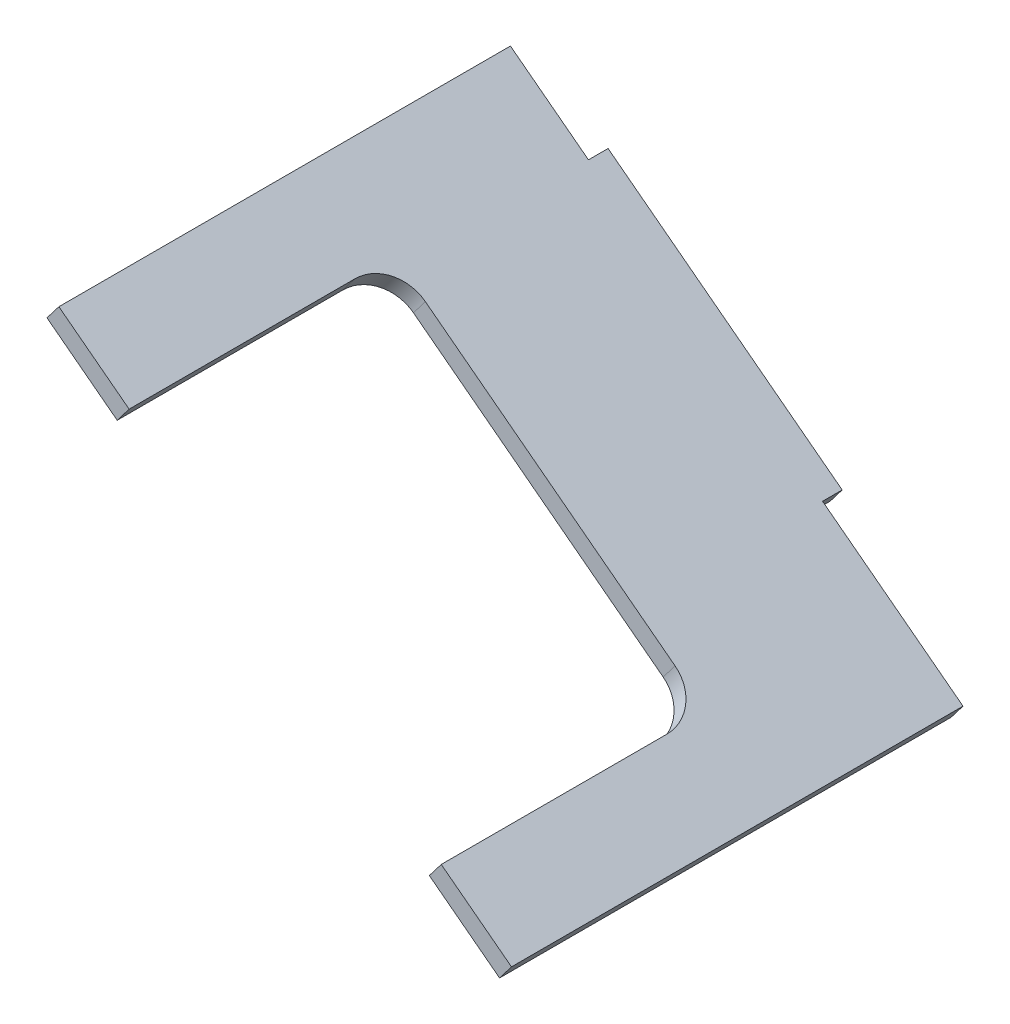
ISO-10303-21;
HEADER;
FILE_DESCRIPTION(('STEP AP214'),'2;1');
FILE_NAME('part.step','',(''),(''),'','','');
FILE_SCHEMA(('AUTOMOTIVE_DESIGN { 1 0 10303 214 1 1 1 1 }'));
ENDSEC;
DATA;
#1=APPLICATION_CONTEXT('core data for automotive mechanical design processes');
#2=APPLICATION_PROTOCOL_DEFINITION('international standard','automotive_design',2000,#1);
#3=PRODUCT_CONTEXT('',#1,'mechanical');
#4=PRODUCT('Part','Part','',(#3));
#5=PRODUCT_RELATED_PRODUCT_CATEGORY('part','',(#4));
#6=PRODUCT_DEFINITION_FORMATION('','',#4);
#7=PRODUCT_DEFINITION_CONTEXT('part definition',#1,'design');
#8=PRODUCT_DEFINITION('design','',#6,#7);
#9=PRODUCT_DEFINITION_SHAPE('','',#8);
#10=(LENGTH_UNIT() NAMED_UNIT(*) SI_UNIT(.MILLI.,.METRE.));
#11=(NAMED_UNIT(*) PLANE_ANGLE_UNIT() SI_UNIT($,.RADIAN.));
#12=(NAMED_UNIT(*) SI_UNIT($,.STERADIAN.) SOLID_ANGLE_UNIT());
#13=UNCERTAINTY_MEASURE_WITH_UNIT(LENGTH_MEASURE(1.E-05),#10,'distance_accuracy_value','');
#14=(GEOMETRIC_REPRESENTATION_CONTEXT(3) GLOBAL_UNCERTAINTY_ASSIGNED_CONTEXT((#13)) GLOBAL_UNIT_ASSIGNED_CONTEXT((#10,
#11,#12)) REPRESENTATION_CONTEXT('',''));
#15=CARTESIAN_POINT('',(0.,0.,0.));
#16=DIRECTION('',(0.,0.,1.));
#17=DIRECTION('',(1.,0.,0.));
#18=AXIS2_PLACEMENT_3D('',#15,#16,#17);
#19=CARTESIAN_POINT('',(-144.,-8.40039843241769E-13,46.));
#20=DIRECTION('',(0.,0.,-1.));
#21=DIRECTION('',(0.,1.,0.));
#22=AXIS2_PLACEMENT_3D('',#19,#20,#21);
#23=PLANE('',#22);
#24=DIRECTION('',(-0.7949376110826,0.606691185436453,0.));
#25=VECTOR('',#24,1.);
#26=CARTESIAN_POINT('',(37.3227741318164,67.208147347463,46.));
#27=LINE('',#26,#25);
#28=CARTESIAN_POINT('',(36.5278365207338,67.8148385328995,46.));
#29=VERTEX_POINT('',#28);
#30=CARTESIAN_POINT('',(29.3733980209904,73.2750592018276,46.));
#31=VERTEX_POINT('',#30);
#32=EDGE_CURVE('E147',#29,#31,#27,.T.);
#33=ORIENTED_EDGE('',*,*,#32,.F.);
#34=DIRECTION('',(0.606691185436452,0.794937611082601,0.));
#35=VECTOR('',#34,1.);
#36=CARTESIAN_POINT('',(-62.6256531425399,-62.1043692873406,46.));
#37=LINE('',#36,#35);
#38=CARTESIAN_POINT('',(37.7412188916067,69.4047137550647,46.));
#39=VERTEX_POINT('',#38);
#40=EDGE_CURVE('E136',#29,#39,#37,.T.);
#41=ORIENTED_EDGE('',*,*,#40,.T.);
#42=DIRECTION('',(0.794937611082601,-0.606691185436452,0.));
#43=VECTOR('',#42,1.);
#44=CARTESIAN_POINT('',(62.3842848351674,50.5972870065347,46.));
#45=LINE('',#44,#43);
#46=CARTESIAN_POINT('',(30.5867803918633,74.8649344239928,46.));
#47=VERTEX_POINT('',#46);
#48=EDGE_CURVE('E145',#47,#39,#45,.T.);
#49=ORIENTED_EDGE('',*,*,#48,.F.);
#50=DIRECTION('',(-0.606691185436453,-0.7949376110826,0.));
#51=VECTOR('',#50,1.);
#52=CARTESIAN_POINT('',(60.5551142552356,114.131955770836,46.));
#53=LINE('',#52,#51);
#54=EDGE_CURVE('E214',#47,#31,#53,.T.);
#55=ORIENTED_EDGE('',*,*,#54,.T.);
#56=EDGE_LOOP('',(#33,#41,#49,#55));
#57=FACE_BOUND('',#56,.T.);
#58=ADVANCED_FACE('F33',(#57),#23,.F.);
#59=CARTESIAN_POINT('',(38.5361565026893,68.7980225696282,77.9334870314499));
#60=DIRECTION('',(0.794937611082609,-0.606691185436442,0.));
#61=DIRECTION('',(0.606691185436442,0.794937611082609,0.));
#62=AXIS2_PLACEMENT_3D('',#59,#60,#61);
#63=PLANE('',#62);
#64=DIRECTION('',(-0.606691185436453,-0.7949376110826,0.));
#65=VECTOR('',#64,1.);
#66=CARTESIAN_POINT('',(68.5044903660616,108.065043916472,0.));
#67=LINE('',#66,#65);
#68=CARTESIAN_POINT('',(38.5361565026893,68.7980225696282,0.));
#69=VERTEX_POINT('',#68);
#70=CARTESIAN_POINT('',(37.3227741318165,67.208147347463,0.));
#71=VERTEX_POINT('',#70);
#72=EDGE_CURVE('E197',#69,#71,#67,.T.);
#73=ORIENTED_EDGE('',*,*,#72,.F.);
#74=DIRECTION('',(0.,0.,-1.));
#75=VECTOR('',#74,1.);
#76=CARTESIAN_POINT('',(38.5361565026893,68.7980225696282,77.9334870314499));
#77=LINE('',#76,#75);
#78=CARTESIAN_POINT('',(38.5361565026893,68.7980225696282,-1.99999999999999));
#79=VERTEX_POINT('',#78);
#80=EDGE_CURVE('E210',#69,#79,#77,.T.);
#81=ORIENTED_EDGE('',*,*,#80,.T.);
#82=DIRECTION('',(-0.606691185436442,-0.794937611082609,0.));
#83=VECTOR('',#82,1.);
#84=CARTESIAN_POINT('',(38.5361565026893,68.7980225696282,-1.99999999999999));
#85=LINE('',#84,#83);
#86=CARTESIAN_POINT('',(37.3227741318164,67.208147347463,-1.99999999999999));
#87=VERTEX_POINT('',#86);
#88=EDGE_CURVE('E162',#79,#87,#85,.T.);
#89=ORIENTED_EDGE('',*,*,#88,.T.);
#90=DIRECTION('',(0.,0.,-1.));
#91=VECTOR('',#90,1.);
#92=CARTESIAN_POINT('',(37.3227741318164,67.208147347463,77.9334870314499));
#93=LINE('',#92,#91);
#94=EDGE_CURVE('E172',#71,#87,#93,.T.);
#95=ORIENTED_EDGE('',*,*,#94,.F.);
#96=EDGE_LOOP('',(#73,#81,#89,#95));
#97=FACE_BOUND('',#96,.T.);
#98=ADVANCED_FACE('F238',(#97),#63,.F.);
#99=CARTESIAN_POINT('',(37.3227741318164,67.208147347463,77.9334870314499));
#100=DIRECTION('',(0.606691185436453,0.7949376110826,0.));
#101=DIRECTION('',(-0.7949376110826,0.606691185436453,0.));
#102=AXIS2_PLACEMENT_3D('',#99,#100,#101);
#103=PLANE('',#102);
#104=DIRECTION('',(0.,0.,-1.));
#105=VECTOR('',#104,1.);
#106=CARTESIAN_POINT('',(68.3253409640378,43.5471911154414,77.9334870314499));
#107=LINE('',#106,#105);
#108=CARTESIAN_POINT('',(68.3253409640378,43.5471911154414,46.));
#109=VERTEX_POINT('',#108);
#110=CARTESIAN_POINT('',(68.3253409640378,43.5471911154414,23.));
#111=VERTEX_POINT('',#110);
#112=EDGE_CURVE('E337',#109,#111,#107,.T.);
#113=ORIENTED_EDGE('',*,*,#112,.T.);
#114=CARTESIAN_POINT('',(65.1455905197074,45.9739558571872,23.));
#115=DIRECTION('',(0.606691185436453,0.7949376110826,0.));
#116=DIRECTION('',(-0.7949376110826,0.606691185436453,0.));
#117=AXIS2_PLACEMENT_3D('',#114,#115,#116);
#118=CIRCLE('',#117,4.);
#119=CARTESIAN_POINT('',(65.1455905197074,45.9739558571872,19.));
#120=VERTEX_POINT('',#119);
#121=EDGE_CURVE('E326',#111,#120,#118,.T.);
#122=ORIENTED_EDGE('',*,*,#121,.T.);
#123=DIRECTION('',(-0.7949376110826,0.606691185436453,0.));
#124=VECTOR('',#123,1.);
#125=CARTESIAN_POINT('',(37.3227741318164,67.208147347463,19.));
#126=LINE('',#125,#124);
#127=CARTESIAN_POINT('',(39.7075869650642,65.3880737911537,19.));
#128=VERTEX_POINT('',#127);
#129=EDGE_CURVE('E181',#120,#128,#126,.T.);
#130=ORIENTED_EDGE('',*,*,#129,.T.);
#131=CARTESIAN_POINT('',(39.7075869650642,65.3880737911537,23.));
#132=DIRECTION('',(0.606691185436453,0.7949376110826,0.));
#133=DIRECTION('',(-0.7949376110826,0.606691185436453,0.));
#134=AXIS2_PLACEMENT_3D('',#131,#132,#133);
#135=CIRCLE('',#134,4.);
#136=CARTESIAN_POINT('',(36.5278365207338,67.8148385328995,23.));
#137=VERTEX_POINT('',#136);
#138=EDGE_CURVE('E11',#128,#137,#135,.T.);
#139=ORIENTED_EDGE('',*,*,#138,.T.);
#140=DIRECTION('',(0.,0.,1.));
#141=VECTOR('',#140,1.);
#142=CARTESIAN_POINT('',(36.5278365207338,67.8148385328995,77.9334870314499));
#143=LINE('',#142,#141);
#144=EDGE_CURVE('E246',#137,#29,#143,.T.);
#145=ORIENTED_EDGE('',*,*,#144,.T.);
#146=ORIENTED_EDGE('',*,*,#32,.T.);
#147=DIRECTION('',(0.,0.,-1.));
#148=VECTOR('',#147,1.);
#149=CARTESIAN_POINT('',(29.3733980209904,73.2750592018276,0.));
#150=LINE('',#149,#148);
#151=CARTESIAN_POINT('',(29.3733980209904,73.2750592018276,0.));
#152=VERTEX_POINT('',#151);
#153=EDGE_CURVE('E198',#31,#152,#150,.T.);
#154=ORIENTED_EDGE('',*,*,#153,.T.);
#155=DIRECTION('',(0.7949376110826,-0.606691185436453,0.));
#156=VECTOR('',#155,1.);
#157=CARTESIAN_POINT('',(37.3227741318165,67.208147347463,0.));
#158=LINE('',#157,#156);
#159=EDGE_CURVE('E201',#152,#71,#158,.T.);
#160=ORIENTED_EDGE('',*,*,#159,.T.);
#161=ORIENTED_EDGE('',*,*,#94,.T.);
#162=DIRECTION('',(0.7949376110826,-0.606691185436453,0.));
#163=VECTOR('',#162,1.);
#164=CARTESIAN_POINT('',(37.3227741318164,67.208147347463,-1.99999999999999));
#165=LINE('',#164,#163);
#166=CARTESIAN_POINT('',(61.1709024642944,49.0074117843694,-1.99999999999999));
#167=VERTEX_POINT('',#166);
#168=EDGE_CURVE('E225',#87,#167,#165,.T.);
#169=ORIENTED_EDGE('',*,*,#168,.T.);
#170=DIRECTION('',(0.,0.,-1.));
#171=VECTOR('',#170,1.);
#172=CARTESIAN_POINT('',(61.1709024642944,49.0074117843694,77.9334870314499));
#173=LINE('',#172,#171);
#174=CARTESIAN_POINT('',(61.1709024642944,49.0074117843694,0.));
#175=VERTEX_POINT('',#174);
#176=EDGE_CURVE('E169',#175,#167,#173,.T.);
#177=ORIENTED_EDGE('',*,*,#176,.F.);
#178=DIRECTION('',(0.794937611082601,-0.606691185436453,0.));
#179=VECTOR('',#178,1.);
#180=CARTESIAN_POINT('',(61.1709024642944,49.0074117843695,0.));
#181=LINE('',#180,#179);
#182=CARTESIAN_POINT('',(75.4797794637813,38.0869704465133,0.));
#183=VERTEX_POINT('',#182);
#184=EDGE_CURVE('E177',#175,#183,#181,.T.);
#185=ORIENTED_EDGE('',*,*,#184,.T.);
#186=DIRECTION('',(0.,0.,1.));
#187=VECTOR('',#186,1.);
#188=CARTESIAN_POINT('',(75.4797794637813,38.0869704465133,0.));
#189=LINE('',#188,#187);
#190=CARTESIAN_POINT('',(75.4797794637813,38.0869704465133,46.));
#191=VERTEX_POINT('',#190);
#192=EDGE_CURVE('E180',#183,#191,#189,.T.);
#193=ORIENTED_EDGE('',*,*,#192,.T.);
#194=EDGE_CURVE('E159',#191,#109,#27,.T.);
#195=ORIENTED_EDGE('',*,*,#194,.T.);
#196=EDGE_LOOP('',(#113,#122,#130,#139,#145,#146,#154,#160,#161,#169,#177,#185,#193,#195));
#197=FACE_BOUND('',#196,.T.);
#198=ADVANCED_FACE('F232',(#197),#103,.F.);
#199=CARTESIAN_POINT('',(62.3842848351674,50.5972870065347,77.9334870314499));
#200=DIRECTION('',(-0.606691185436452,-0.794937611082601,0.));
#201=DIRECTION('',(0.794937611082601,-0.606691185436452,0.));
#202=AXIS2_PLACEMENT_3D('',#199,#200,#201);
#203=PLANE('',#202);
#204=ORIENTED_EDGE('',*,*,#48,.T.);
#205=DIRECTION('',(0.,0.,1.));
#206=VECTOR('',#205,1.);
#207=CARTESIAN_POINT('',(37.7412188916067,69.4047137550647,46.));
#208=LINE('',#207,#206);
#209=CARTESIAN_POINT('',(37.7412188916067,69.4047137550647,23.));
#210=VERTEX_POINT('',#209);
#211=EDGE_CURVE('E133',#210,#39,#208,.T.);
#212=ORIENTED_EDGE('',*,*,#211,.F.);
#213=CARTESIAN_POINT('',(40.9209693359371,66.9779490133189,23.));
#214=DIRECTION('',(-0.606691185436452,-0.794937611082601,0.));
#215=DIRECTION('',(0.794937611082601,-0.606691185436452,0.));
#216=AXIS2_PLACEMENT_3D('',#213,#214,#215);
#217=CIRCLE('',#216,4.);
#218=CARTESIAN_POINT('',(40.9209693359371,66.9779490133189,19.));
#219=VERTEX_POINT('',#218);
#220=EDGE_CURVE('E41',#210,#219,#217,.T.);
#221=ORIENTED_EDGE('',*,*,#220,.T.);
#222=DIRECTION('',(-0.794937611082601,0.606691185436452,0.));
#223=VECTOR('',#222,1.);
#224=CARTESIAN_POINT('',(37.7412188916067,69.4047137550647,19.));
#225=LINE('',#224,#223);
#226=CARTESIAN_POINT('',(66.3589728905804,47.5638310793524,19.));
#227=VERTEX_POINT('',#226);
#228=EDGE_CURVE('E320',#227,#219,#225,.T.);
#229=ORIENTED_EDGE('',*,*,#228,.F.);
#230=CARTESIAN_POINT('',(66.3589728905804,47.5638310793524,23.));
#231=DIRECTION('',(-0.606691185436452,-0.794937611082601,0.));
#232=DIRECTION('',(0.794937611082601,-0.606691185436452,0.));
#233=AXIS2_PLACEMENT_3D('',#230,#231,#232);
#234=CIRCLE('',#233,4.);
#235=CARTESIAN_POINT('',(69.5387233349108,45.1370663376066,23.));
#236=VERTEX_POINT('',#235);
#237=EDGE_CURVE('E324',#227,#236,#234,.T.);
#238=ORIENTED_EDGE('',*,*,#237,.T.);
#239=DIRECTION('',(0.,0.,-1.));
#240=VECTOR('',#239,1.);
#241=CARTESIAN_POINT('',(69.5387233349108,45.1370663376066,46.));
#242=LINE('',#241,#240);
#243=CARTESIAN_POINT('',(69.5387233349108,45.1370663376066,46.));
#244=VERTEX_POINT('',#243);
#245=EDGE_CURVE('E141',#244,#236,#242,.T.);
#246=ORIENTED_EDGE('',*,*,#245,.F.);
#247=CARTESIAN_POINT('',(76.6931618346542,39.6768456686786,46.));
#248=VERTEX_POINT('',#247);
#249=EDGE_CURVE('E155',#244,#248,#45,.T.);
#250=ORIENTED_EDGE('',*,*,#249,.T.);
#251=DIRECTION('',(0.,0.,-1.));
#252=VECTOR('',#251,1.);
#253=CARTESIAN_POINT('',(76.6931618346542,39.6768456686786,0.));
#254=LINE('',#253,#252);
#255=CARTESIAN_POINT('',(76.6931618346542,39.6768456686786,0.));
#256=VERTEX_POINT('',#255);
#257=EDGE_CURVE('E284',#248,#256,#254,.T.);
#258=ORIENTED_EDGE('',*,*,#257,.T.);
#259=DIRECTION('',(-0.794937611082601,0.606691185436452,0.));
#260=VECTOR('',#259,1.);
#261=CARTESIAN_POINT('',(62.3842848351674,50.5972870065346,0.));
#262=LINE('',#261,#260);
#263=CARTESIAN_POINT('',(62.3842848351674,50.5972870065347,0.));
#264=VERTEX_POINT('',#263);
#265=EDGE_CURVE('E189',#256,#264,#262,.T.);
#266=ORIENTED_EDGE('',*,*,#265,.T.);
#267=DIRECTION('',(0.,0.,-1.));
#268=VECTOR('',#267,1.);
#269=CARTESIAN_POINT('',(62.3842848351674,50.5972870065347,77.9334870314499));
#270=LINE('',#269,#268);
#271=CARTESIAN_POINT('',(62.3842848351674,50.5972870065347,-1.99999999999999));
#272=VERTEX_POINT('',#271);
#273=EDGE_CURVE('E174',#264,#272,#270,.T.);
#274=ORIENTED_EDGE('',*,*,#273,.T.);
#275=DIRECTION('',(-0.794937611082601,0.606691185436452,0.));
#276=VECTOR('',#275,1.);
#277=CARTESIAN_POINT('',(62.3842848351674,50.5972870065347,-1.99999999999999));
#278=LINE('',#277,#276);
#279=EDGE_CURVE('E217',#272,#79,#278,.T.);
#280=ORIENTED_EDGE('',*,*,#279,.T.);
#281=ORIENTED_EDGE('',*,*,#80,.F.);
#282=DIRECTION('',(-0.794937611082601,0.606691185436452,0.));
#283=VECTOR('',#282,1.);
#284=CARTESIAN_POINT('',(38.5361565026894,68.7980225696282,0.));
#285=LINE('',#284,#283);
#286=CARTESIAN_POINT('',(30.5867803918633,74.8649344239928,0.));
#287=VERTEX_POINT('',#286);
#288=EDGE_CURVE('E196',#69,#287,#285,.T.);
#289=ORIENTED_EDGE('',*,*,#288,.T.);
#290=DIRECTION('',(0.,0.,1.));
#291=VECTOR('',#290,1.);
#292=CARTESIAN_POINT('',(30.5867803918633,74.8649344239928,0.));
#293=LINE('',#292,#291);
#294=EDGE_CURVE('E153',#287,#47,#293,.T.);
#295=ORIENTED_EDGE('',*,*,#294,.T.);
#296=EDGE_LOOP('',(#204,#212,#221,#229,#238,#246,#250,#258,#266,#274,#280,#281,#289,#295));
#297=FACE_BOUND('',#296,.T.);
#298=ADVANCED_FACE('F151',(#297),#203,.F.);
#299=CARTESIAN_POINT('',(61.1709024642944,49.0074117843694,77.9334870314499));
#300=DIRECTION('',(-0.794937611082602,0.606691185436451,0.));
#301=DIRECTION('',(-0.606691185436451,-0.794937611082602,0.));
#302=AXIS2_PLACEMENT_3D('',#299,#300,#301);
#303=PLANE('',#302);
#304=ORIENTED_EDGE('',*,*,#273,.F.);
#305=DIRECTION('',(-0.606691185436453,-0.7949376110826,0.));
#306=VECTOR('',#305,1.);
#307=CARTESIAN_POINT('',(92.3526186985396,89.8643083533781,0.));
#308=LINE('',#307,#306);
#309=EDGE_CURVE('E184',#264,#175,#308,.T.);
#310=ORIENTED_EDGE('',*,*,#309,.T.);
#311=ORIENTED_EDGE('',*,*,#176,.T.);
#312=DIRECTION('',(0.606691185436451,0.794937611082602,0.));
#313=VECTOR('',#312,1.);
#314=CARTESIAN_POINT('',(61.1709024642944,49.0074117843694,-1.99999999999999));
#315=LINE('',#314,#313);
#316=EDGE_CURVE('E173',#167,#272,#315,.T.);
#317=ORIENTED_EDGE('',*,*,#316,.T.);
#318=EDGE_LOOP('',(#304,#310,#311,#317));
#319=FACE_BOUND('',#318,.T.);
#320=ADVANCED_FACE('F271',(#319),#303,.F.);
#321=ORIENTED_EDGE('',*,*,#249,.F.);
#322=DIRECTION('',(-0.606691185436452,-0.794937611082601,0.));
#323=VECTOR('',#322,1.);
#324=CARTESIAN_POINT('',(-30.8281486992358,-86.3720167047987,46.));
#325=LINE('',#324,#323);
#326=EDGE_CURVE('E149',#244,#109,#325,.T.);
#327=ORIENTED_EDGE('',*,*,#326,.T.);
#328=ORIENTED_EDGE('',*,*,#194,.F.);
#329=DIRECTION('',(-0.606691185436453,-0.7949376110826,0.));
#330=VECTOR('',#329,1.);
#331=CARTESIAN_POINT('',(106.661495698026,78.943867015522,46.));
#332=LINE('',#331,#330);
#333=EDGE_CURVE('E281',#248,#191,#332,.T.);
#334=ORIENTED_EDGE('',*,*,#333,.F.);
#335=EDGE_LOOP('',(#321,#327,#328,#334));
#336=FACE_BOUND('',#335,.T.);
#337=ADVANCED_FACE('F260',(#336),#23,.F.);
#338=CARTESIAN_POINT('',(-1.11022302462516E-13,-8.31799906730879E-13,-1.99999999999999));
#339=DIRECTION('',(0.,0.,-1.));
#340=DIRECTION('',(-1.,0.,0.));
#341=AXIS2_PLACEMENT_3D('',#338,#339,#340);
#342=PLANE('',#341);
#343=ORIENTED_EDGE('',*,*,#316,.F.);
#344=ORIENTED_EDGE('',*,*,#168,.F.);
#345=ORIENTED_EDGE('',*,*,#88,.F.);
#346=ORIENTED_EDGE('',*,*,#279,.F.);
#347=EDGE_LOOP('',(#343,#344,#345,#346));
#348=FACE_BOUND('',#347,.T.);
#349=ADVANCED_FACE('F236',(#348),#342,.T.);
#350=CARTESIAN_POINT('',(68.5044903660616,108.065043916472,0.));
#351=DIRECTION('',(0.,0.,-1.));
#352=DIRECTION('',(-1.,0.,0.));
#353=AXIS2_PLACEMENT_3D('',#350,#351,#352);
#354=PLANE('',#353);
#355=ORIENTED_EDGE('',*,*,#288,.F.);
#356=ORIENTED_EDGE('',*,*,#72,.T.);
#357=ORIENTED_EDGE('',*,*,#159,.F.);
#358=DIRECTION('',(-0.606691185436453,-0.7949376110826,0.));
#359=VECTOR('',#358,1.);
#360=CARTESIAN_POINT('',(60.5551142552356,114.131955770836,0.));
#361=LINE('',#360,#359);
#362=EDGE_CURVE('E204',#287,#152,#361,.T.);
#363=ORIENTED_EDGE('',*,*,#362,.F.);
#364=EDGE_LOOP('',(#355,#356,#357,#363));
#365=FACE_BOUND('',#364,.T.);
#366=ADVANCED_FACE('F251',(#365),#354,.T.);
#367=CARTESIAN_POINT('',(60.5551142552356,114.131955770836,0.));
#368=DIRECTION('',(-0.7949376110826,0.606691185436453,0.));
#369=DIRECTION('',(-0.606691185436453,-0.7949376110826,0.));
#370=AXIS2_PLACEMENT_3D('',#367,#368,#369);
#371=PLANE('',#370);
#372=ORIENTED_EDGE('',*,*,#294,.F.);
#373=ORIENTED_EDGE('',*,*,#362,.T.);
#374=ORIENTED_EDGE('',*,*,#153,.F.);
#375=ORIENTED_EDGE('',*,*,#54,.F.);
#376=EDGE_LOOP('',(#372,#373,#374,#375));
#377=FACE_BOUND('',#376,.T.);
#378=ADVANCED_FACE('F248',(#377),#371,.T.);
#379=CARTESIAN_POINT('',(106.661495698026,78.943867015522,0.));
#380=DIRECTION('',(0.7949376110826,-0.606691185436453,0.));
#381=DIRECTION('',(0.606691185436453,0.7949376110826,0.));
#382=AXIS2_PLACEMENT_3D('',#379,#380,#381);
#383=PLANE('',#382);
#384=ORIENTED_EDGE('',*,*,#257,.F.);
#385=ORIENTED_EDGE('',*,*,#333,.T.);
#386=ORIENTED_EDGE('',*,*,#192,.F.);
#387=DIRECTION('',(-0.606691185436453,-0.7949376110826,0.));
#388=VECTOR('',#387,1.);
#389=CARTESIAN_POINT('',(106.661495698026,78.943867015522,0.));
#390=LINE('',#389,#388);
#391=EDGE_CURVE('E188',#256,#183,#390,.T.);
#392=ORIENTED_EDGE('',*,*,#391,.F.);
#393=EDGE_LOOP('',(#384,#385,#386,#392));
#394=FACE_BOUND('',#393,.T.);
#395=ADVANCED_FACE('F258',(#394),#383,.T.);
#396=CARTESIAN_POINT('',(92.3526186985396,89.8643083533781,0.));
#397=DIRECTION('',(0.,0.,-1.));
#398=DIRECTION('',(-1.,0.,0.));
#399=AXIS2_PLACEMENT_3D('',#396,#397,#398);
#400=PLANE('',#399);
#401=ORIENTED_EDGE('',*,*,#265,.F.);
#402=ORIENTED_EDGE('',*,*,#391,.T.);
#403=ORIENTED_EDGE('',*,*,#184,.F.);
#404=ORIENTED_EDGE('',*,*,#309,.F.);
#405=EDGE_LOOP('',(#401,#402,#403,#404));
#406=FACE_BOUND('',#405,.T.);
#407=ADVANCED_FACE('F296',(#406),#400,.T.);
#408=CARTESIAN_POINT('',(31.6743070372422,61.4553376442387,19.));
#409=DIRECTION('',(0.,0.,-1.));
#410=DIRECTION('',(-1.,0.,0.));
#411=AXIS2_PLACEMENT_3D('',#408,#409,#410);
#412=PLANE('',#411);
#413=ORIENTED_EDGE('',*,*,#129,.F.);
#414=DIRECTION('',(0.606691185436452,0.794937611082601,0.));
#415=VECTOR('',#414,1.);
#416=CARTESIAN_POINT('',(66.3589728905804,47.5638310793524,19.));
#417=LINE('',#416,#415);
#418=EDGE_CURVE('E327',#120,#227,#417,.T.);
#419=ORIENTED_EDGE('',*,*,#418,.T.);
#420=ORIENTED_EDGE('',*,*,#228,.T.);
#421=DIRECTION('',(0.606691185436452,0.794937611082601,0.));
#422=VECTOR('',#421,1.);
#423=CARTESIAN_POINT('',(39.7075869650642,65.3880737911537,19.));
#424=LINE('',#423,#422);
#425=EDGE_CURVE('E148',#219,#128,#424,.F.);
#426=ORIENTED_EDGE('',*,*,#425,.T.);
#427=EDGE_LOOP('',(#413,#419,#420,#426));
#428=FACE_BOUND('',#427,.T.);
#429=ADVANCED_FACE('F299',(#428),#412,.F.);
#430=CARTESIAN_POINT('',(31.6743070372422,61.4553376442387,46.));
#431=DIRECTION('',(-0.794937611082601,0.606691185436452,0.));
#432=DIRECTION('',(-0.606691185436452,-0.794937611082601,0.));
#433=AXIS2_PLACEMENT_3D('',#430,#431,#432);
#434=PLANE('',#433);
#435=ORIENTED_EDGE('',*,*,#144,.F.);
#436=DIRECTION('',(0.606691185436452,0.794937611082601,0.));
#437=VECTOR('',#436,1.);
#438=CARTESIAN_POINT('',(37.7412188916067,69.4047137550647,23.));
#439=LINE('',#438,#437);
#440=EDGE_CURVE('E138',#137,#210,#439,.T.);
#441=ORIENTED_EDGE('',*,*,#440,.T.);
#442=ORIENTED_EDGE('',*,*,#211,.T.);
#443=ORIENTED_EDGE('',*,*,#40,.F.);
#444=EDGE_LOOP('',(#435,#441,#442,#443));
#445=FACE_BOUND('',#444,.T.);
#446=ADVANCED_FACE('F135',(#445),#434,.F.);
#447=CARTESIAN_POINT('',(63.4718114805463,37.1876902267806,46.));
#448=DIRECTION('',(0.794937611082601,-0.606691185436452,0.));
#449=DIRECTION('',(0.606691185436452,0.794937611082601,0.));
#450=AXIS2_PLACEMENT_3D('',#447,#448,#449);
#451=PLANE('',#450);
#452=ORIENTED_EDGE('',*,*,#245,.T.);
#453=DIRECTION('',(0.606691185436452,0.794937611082601,0.));
#454=VECTOR('',#453,1.);
#455=CARTESIAN_POINT('',(68.3253409640378,43.5471911154414,23.));
#456=LINE('',#455,#454);
#457=EDGE_CURVE('E319',#236,#111,#456,.F.);
#458=ORIENTED_EDGE('',*,*,#457,.T.);
#459=ORIENTED_EDGE('',*,*,#112,.F.);
#460=ORIENTED_EDGE('',*,*,#326,.F.);
#461=EDGE_LOOP('',(#452,#458,#459,#460));
#462=FACE_BOUND('',#461,.T.);
#463=ADVANCED_FACE('F310',(#462),#451,.F.);
#464=CARTESIAN_POINT('',(60.2920610362159,39.6144549685264,23.));
#465=DIRECTION('',(-0.606691185436452,-0.794937611082601,0.));
#466=DIRECTION('',(0.794937611082601,-0.606691185436452,0.));
#467=AXIS2_PLACEMENT_3D('',#464,#465,#466);
#468=CYLINDRICAL_SURFACE('',#467,4.);
#469=ORIENTED_EDGE('',*,*,#121,.F.);
#470=ORIENTED_EDGE('',*,*,#457,.F.);
#471=ORIENTED_EDGE('',*,*,#237,.F.);
#472=ORIENTED_EDGE('',*,*,#418,.F.);
#473=EDGE_LOOP('',(#469,#470,#471,#472));
#474=FACE_BOUND('',#473,.T.);
#475=ADVANCED_FACE('F312',(#474),#468,.F.);
#476=CARTESIAN_POINT('',(34.8540574815726,59.0285729024929,23.));
#477=DIRECTION('',(-0.606691185436452,-0.794937611082601,0.));
#478=DIRECTION('',(0.794937611082601,-0.606691185436452,0.));
#479=AXIS2_PLACEMENT_3D('',#476,#477,#478);
#480=CYLINDRICAL_SURFACE('',#479,4.);
#481=ORIENTED_EDGE('',*,*,#138,.F.);
#482=ORIENTED_EDGE('',*,*,#425,.F.);
#483=ORIENTED_EDGE('',*,*,#220,.F.);
#484=ORIENTED_EDGE('',*,*,#440,.F.);
#485=EDGE_LOOP('',(#481,#482,#483,#484));
#486=FACE_BOUND('',#485,.T.);
#487=ADVANCED_FACE('F35',(#486),#480,.F.);
#488=CLOSED_SHELL('',(#58,#98,#198,#298,#320,#337,#349,#366,#378,#395,#407,#429,#446,#463,#475,#487));
#489=MANIFOLD_SOLID_BREP('B2',#488);
#490=ADVANCED_BREP_SHAPE_REPRESENTATION('',(#18,#489),#14);
#491=SHAPE_DEFINITION_REPRESENTATION(#9,#490);
ENDSEC;
END-ISO-10303-21;
